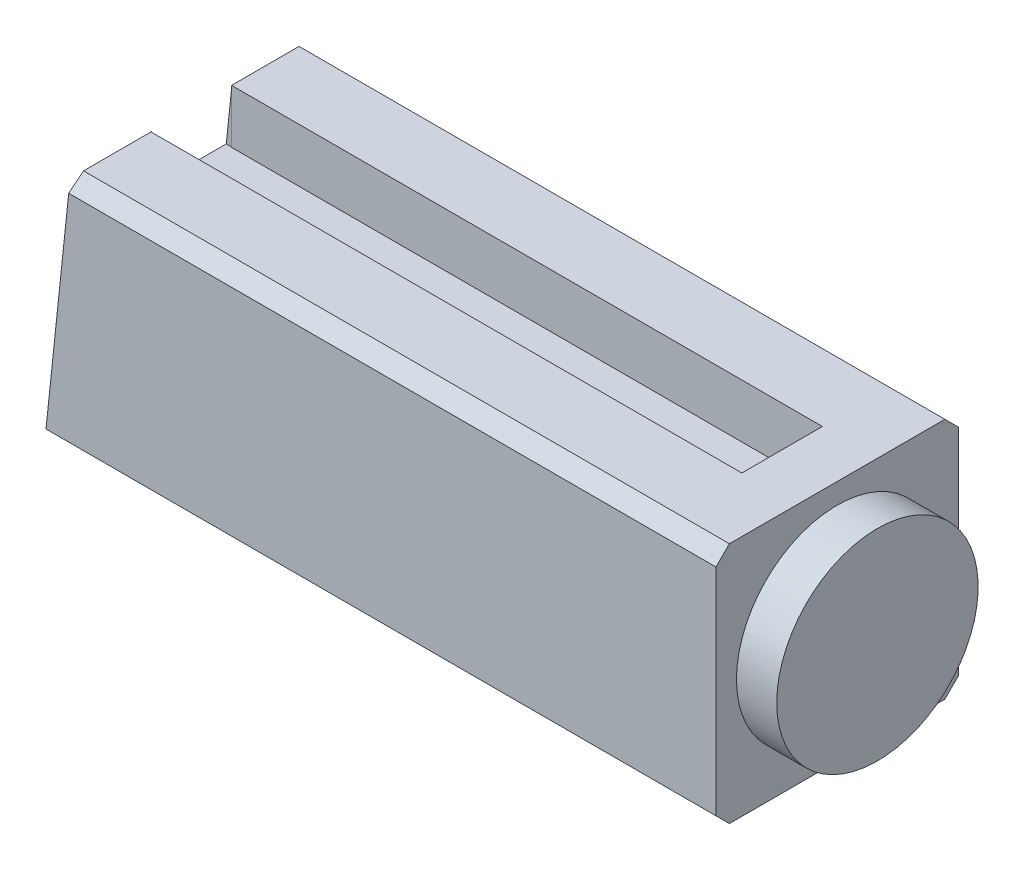
ISO-10303-21;
HEADER;
FILE_DESCRIPTION(('STEP AP214'),'2;1');
FILE_NAME('part.step','',(''),(''),'','','');
FILE_SCHEMA(('AUTOMOTIVE_DESIGN { 1 0 10303 214 1 1 1 1 }'));
ENDSEC;
DATA;
#1=APPLICATION_CONTEXT('core data for automotive mechanical design processes');
#2=APPLICATION_PROTOCOL_DEFINITION('international standard','automotive_design',2000,#1);
#3=PRODUCT_CONTEXT('',#1,'mechanical');
#4=PRODUCT('Part','Part','',(#3));
#5=PRODUCT_RELATED_PRODUCT_CATEGORY('part','',(#4));
#6=PRODUCT_DEFINITION_FORMATION('','',#4);
#7=PRODUCT_DEFINITION_CONTEXT('part definition',#1,'design');
#8=PRODUCT_DEFINITION('design','',#6,#7);
#9=PRODUCT_DEFINITION_SHAPE('','',#8);
#10=(LENGTH_UNIT() NAMED_UNIT(*) SI_UNIT(.MILLI.,.METRE.));
#11=(NAMED_UNIT(*) PLANE_ANGLE_UNIT() SI_UNIT($,.RADIAN.));
#12=(NAMED_UNIT(*) SI_UNIT($,.STERADIAN.) SOLID_ANGLE_UNIT());
#13=UNCERTAINTY_MEASURE_WITH_UNIT(LENGTH_MEASURE(1.E-05),#10,'distance_accuracy_value','');
#14=(GEOMETRIC_REPRESENTATION_CONTEXT(3) GLOBAL_UNCERTAINTY_ASSIGNED_CONTEXT((#13)) GLOBAL_UNIT_ASSIGNED_CONTEXT((#10,
#11,#12)) REPRESENTATION_CONTEXT('',''));
#15=CARTESIAN_POINT('',(0.,0.,0.));
#16=DIRECTION('',(0.,0.,1.));
#17=DIRECTION('',(1.,0.,0.));
#18=AXIS2_PLACEMENT_3D('',#15,#16,#17);
#19=CARTESIAN_POINT('',(-6.1087,1.27635,1.53035));
#20=DIRECTION('',(0.,0.,-1.));
#21=DIRECTION('',(-1.,0.,0.));
#22=AXIS2_PLACEMENT_3D('',#19,#20,#21);
#23=PLANE('',#22);
#24=DIRECTION('',(-0.707106781186547,-0.707106781186548,0.));
#25=VECTOR('',#24,1.);
#26=CARTESIAN_POINT('',(4.0513,1.27635,1.53035));
#27=LINE('',#26,#25);
#28=CARTESIAN_POINT('',(5.0673,2.29235,1.53035));
#29=VERTEX_POINT('',#28);
#30=CARTESIAN_POINT('',(4.0513,1.27635,1.53035));
#31=VERTEX_POINT('',#30);
#32=EDGE_CURVE('E164',#29,#31,#27,.T.);
#33=ORIENTED_EDGE('',*,*,#32,.F.);
#34=DIRECTION('',(-1.,0.,0.));
#35=VECTOR('',#34,1.);
#36=CARTESIAN_POINT('',(-6.1087,2.29235,1.53035));
#37=LINE('',#36,#35);
#38=CARTESIAN_POINT('',(-6.1087,2.29235,1.53035));
#39=VERTEX_POINT('',#38);
#40=EDGE_CURVE('E194',#29,#39,#37,.T.);
#41=ORIENTED_EDGE('',*,*,#40,.T.);
#42=DIRECTION('',(0.,1.,0.));
#43=VECTOR('',#42,1.);
#44=CARTESIAN_POINT('',(-6.1087,1.27635,1.53035));
#45=LINE('',#44,#43);
#46=CARTESIAN_POINT('',(-6.1087,1.27635,1.53035));
#47=VERTEX_POINT('',#46);
#48=EDGE_CURVE('E205',#47,#39,#45,.T.);
#49=ORIENTED_EDGE('',*,*,#48,.F.);
#50=DIRECTION('',(-1.,0.,0.));
#51=VECTOR('',#50,1.);
#52=CARTESIAN_POINT('',(-6.1087,1.27635,1.53035));
#53=LINE('',#52,#51);
#54=EDGE_CURVE('E151',#31,#47,#53,.T.);
#55=ORIENTED_EDGE('',*,*,#54,.F.);
#56=EDGE_LOOP('',(#33,#41,#49,#55));
#57=FACE_BOUND('',#56,.T.);
#58=ADVANCED_FACE('F35',(#57),#23,.F.);
#59=CARTESIAN_POINT('',(-6.1087,1.27635,3.05435));
#60=DIRECTION('',(0.,0.,1.));
#61=DIRECTION('',(1.,0.,0.));
#62=AXIS2_PLACEMENT_3D('',#59,#60,#61);
#63=PLANE('',#62);
#64=DIRECTION('',(-0.707106781186547,-0.707106781186548,0.));
#65=VECTOR('',#64,1.);
#66=CARTESIAN_POINT('',(4.0513,1.27635,3.05435));
#67=LINE('',#66,#65);
#68=CARTESIAN_POINT('',(5.0673,2.29235,3.05435));
#69=VERTEX_POINT('',#68);
#70=CARTESIAN_POINT('',(4.0513,1.27635,3.05435));
#71=VERTEX_POINT('',#70);
#72=EDGE_CURVE('E154',#69,#71,#67,.T.);
#73=ORIENTED_EDGE('',*,*,#72,.T.);
#74=DIRECTION('',(1.,0.,0.));
#75=VECTOR('',#74,1.);
#76=CARTESIAN_POINT('',(-6.1087,1.27635,3.05435));
#77=LINE('',#76,#75);
#78=CARTESIAN_POINT('',(-6.1087,1.27635,3.05435));
#79=VERTEX_POINT('',#78);
#80=EDGE_CURVE('E142',#79,#71,#77,.T.);
#81=ORIENTED_EDGE('',*,*,#80,.F.);
#82=DIRECTION('',(0.,1.,0.));
#83=VECTOR('',#82,1.);
#84=CARTESIAN_POINT('',(-6.1087,1.27635,3.05435));
#85=LINE('',#84,#83);
#86=CARTESIAN_POINT('',(-6.1087,2.29235,3.05435));
#87=VERTEX_POINT('',#86);
#88=EDGE_CURVE('E197',#79,#87,#85,.T.);
#89=ORIENTED_EDGE('',*,*,#88,.T.);
#90=DIRECTION('',(1.,0.,0.));
#91=VECTOR('',#90,1.);
#92=CARTESIAN_POINT('',(-6.1087,2.29235,3.05435));
#93=LINE('',#92,#91);
#94=EDGE_CURVE('E157',#87,#69,#93,.T.);
#95=ORIENTED_EDGE('',*,*,#94,.T.);
#96=EDGE_LOOP('',(#73,#81,#89,#95));
#97=FACE_BOUND('',#96,.T.);
#98=ADVANCED_FACE('F155',(#97),#63,.F.);
#99=CARTESIAN_POINT('',(0.,1.27635,0.));
#100=DIRECTION('',(0.,-1.,0.));
#101=DIRECTION('',(0.,0.,-1.));
#102=AXIS2_PLACEMENT_3D('',#99,#100,#101);
#103=PLANE('',#102);
#104=DIRECTION('',(0.,0.,-1.));
#105=VECTOR('',#104,1.);
#106=CARTESIAN_POINT('',(4.0513,1.27635,4.5867));
#107=LINE('',#106,#105);
#108=EDGE_CURVE('E51',#71,#31,#107,.T.);
#109=ORIENTED_EDGE('',*,*,#108,.T.);
#110=ORIENTED_EDGE('',*,*,#54,.T.);
#111=DIRECTION('',(0.,0.,-1.));
#112=VECTOR('',#111,1.);
#113=CARTESIAN_POINT('',(-6.1087,1.27635,3.048));
#114=LINE('',#113,#112);
#115=CARTESIAN_POINT('',(-6.1087,1.27635,1.524));
#116=VERTEX_POINT('',#115);
#117=EDGE_CURVE('E178',#47,#116,#114,.T.);
#118=ORIENTED_EDGE('',*,*,#117,.T.);
#119=DIRECTION('',(1.,0.,0.));
#120=VECTOR('',#119,1.);
#121=CARTESIAN_POINT('',(-6.5913,1.27635,1.524));
#122=LINE('',#121,#120);
#123=CARTESIAN_POINT('',(-6.21564736842105,1.27635,1.524));
#124=VERTEX_POINT('',#123);
#125=EDGE_CURVE('E184',#124,#116,#122,.T.);
#126=ORIENTED_EDGE('',*,*,#125,.F.);
#127=DIRECTION('',(0.,0.,-1.));
#128=VECTOR('',#127,1.);
#129=CARTESIAN_POINT('',(-6.21564736842105,1.27635,4.5847));
#130=LINE('',#129,#128);
#131=CARTESIAN_POINT('',(-6.21564736842105,1.27635,3.048));
#132=VERTEX_POINT('',#131);
#133=EDGE_CURVE('E186',#132,#124,#130,.T.);
#134=ORIENTED_EDGE('',*,*,#133,.F.);
#135=DIRECTION('',(1.,0.,0.));
#136=VECTOR('',#135,1.);
#137=CARTESIAN_POINT('',(-6.5913,1.27635,3.048));
#138=LINE('',#137,#136);
#139=CARTESIAN_POINT('',(-6.1087,1.27635,3.048));
#140=VERTEX_POINT('',#139);
#141=EDGE_CURVE('E183',#132,#140,#138,.T.);
#142=ORIENTED_EDGE('',*,*,#141,.T.);
#143=DIRECTION('',(0.,0.,1.));
#144=VECTOR('',#143,1.);
#145=CARTESIAN_POINT('',(-6.1087,1.27635,3.05435));
#146=LINE('',#145,#144);
#147=EDGE_CURVE('E147',#140,#79,#146,.T.);
#148=ORIENTED_EDGE('',*,*,#147,.T.);
#149=ORIENTED_EDGE('',*,*,#80,.T.);
#150=EDGE_LOOP('',(#109,#110,#118,#126,#134,#142,#148,#149));
#151=FACE_BOUND('',#150,.T.);
#152=ADVANCED_FACE('F144',(#151),#103,.F.);
#153=CARTESIAN_POINT('',(-6.28041095890411,0.661095890410957,4.5847));
#154=DIRECTION('',(0.994505452921406,-0.104684784518042,0.));
#155=DIRECTION('',(0.104684784518042,0.994505452921406,0.));
#156=AXIS2_PLACEMENT_3D('',#153,#154,#155);
#157=PLANE('',#156);
#158=DIRECTION('',(0.,0.,-1.));
#159=VECTOR('',#158,1.);
#160=CARTESIAN_POINT('',(-6.5913,-2.29235,4.5847));
#161=LINE('',#160,#159);
#162=CARTESIAN_POINT('',(-6.5913,-2.29235,4.3307));
#163=VERTEX_POINT('',#162);
#164=CARTESIAN_POINT('',(-6.5913,-2.29235,0.254000000000003));
#165=VERTEX_POINT('',#164);
#166=EDGE_CURVE('E230',#163,#165,#161,.T.);
#167=ORIENTED_EDGE('',*,*,#166,.F.);
#168=DIRECTION('',(0.0742269619025201,0.705156138073943,0.705156138073948));
#169=VECTOR('',#168,1.);
#170=CARTESIAN_POINT('',(-6.52839476584022,-1.6947502754821,4.92829972451791));
#171=LINE('',#170,#169);
#172=CARTESIAN_POINT('',(-6.56456315789474,-2.03835,4.5847));
#173=VERTEX_POINT('',#172);
#174=EDGE_CURVE('E257',#163,#173,#171,.T.);
#175=ORIENTED_EDGE('',*,*,#174,.T.);
#176=DIRECTION('',(-0.104684784518043,-0.994505452921406,0.));
#177=VECTOR('',#176,1.);
#178=CARTESIAN_POINT('',(-6.28041095890411,0.661095890410957,4.5847));
#179=LINE('',#178,#177);
#180=CARTESIAN_POINT('',(-6.13543684210526,2.03835,4.5847));
#181=VERTEX_POINT('',#180);
#182=EDGE_CURVE('E209',#181,#173,#179,.T.);
#183=ORIENTED_EDGE('',*,*,#182,.F.);
#184=DIRECTION('',(-0.0742269619025204,-0.705156138073945,0.705156138073945));
#185=VECTOR('',#184,1.);
#186=CARTESIAN_POINT('',(-6.07504325068871,2.6120891184573,4.0109608815427));
#187=LINE('',#186,#185);
#188=CARTESIAN_POINT('',(-6.1087,2.29235,4.3307));
#189=VERTEX_POINT('',#188);
#190=EDGE_CURVE('E59',#181,#189,#187,.F.);
#191=ORIENTED_EDGE('',*,*,#190,.T.);
#192=DIRECTION('',(0.,0.,-1.));
#193=VECTOR('',#192,1.);
#194=CARTESIAN_POINT('',(-6.1087,2.29235,4.5847));
#195=LINE('',#194,#193);
#196=EDGE_CURVE('E221',#189,#87,#195,.T.);
#197=ORIENTED_EDGE('',*,*,#196,.T.);
#198=DIRECTION('',(0.,0.,1.));
#199=VECTOR('',#198,1.);
#200=CARTESIAN_POINT('',(-6.1087,2.29235,3.05435));
#201=LINE('',#200,#199);
#202=CARTESIAN_POINT('',(-6.1087,2.29235,3.048));
#203=VERTEX_POINT('',#202);
#204=EDGE_CURVE('E193',#203,#87,#201,.T.);
#205=ORIENTED_EDGE('',*,*,#204,.F.);
#206=DIRECTION('',(-0.104684784518042,-0.994505452921406,0.));
#207=VECTOR('',#206,1.);
#208=CARTESIAN_POINT('',(-6.28041095890411,0.661095890410957,3.048));
#209=LINE('',#208,#207);
#210=EDGE_CURVE('E190',#203,#132,#209,.T.);
#211=ORIENTED_EDGE('',*,*,#210,.T.);
#212=ORIENTED_EDGE('',*,*,#133,.T.);
#213=DIRECTION('',(0.104684784518042,0.994505452921406,0.));
#214=VECTOR('',#213,1.);
#215=CARTESIAN_POINT('',(-6.28041095890411,0.661095890410958,1.524));
#216=LINE('',#215,#214);
#217=CARTESIAN_POINT('',(-6.1087,2.29235,1.524));
#218=VERTEX_POINT('',#217);
#219=EDGE_CURVE('E176',#124,#218,#216,.T.);
#220=ORIENTED_EDGE('',*,*,#219,.T.);
#221=CARTESIAN_POINT('',(-6.1087,2.29235,0.254000000000003));
#222=VERTEX_POINT('',#221);
#223=EDGE_CURVE('E216',#218,#222,#195,.T.);
#224=ORIENTED_EDGE('',*,*,#223,.T.);
#225=DIRECTION('',(-0.0742269619025204,-0.705156138073945,-0.705156138073945));
#226=VECTOR('',#225,1.);
#227=CARTESIAN_POINT('',(-6.10163278236915,2.35948856749311,0.321138567493112));
#228=LINE('',#227,#226);
#229=CARTESIAN_POINT('',(-6.13543684210526,2.03835,0.));
#230=VERTEX_POINT('',#229);
#231=EDGE_CURVE('E252',#222,#230,#228,.T.);
#232=ORIENTED_EDGE('',*,*,#231,.T.);
#233=DIRECTION('',(-0.104684784518043,-0.994505452921406,0.));
#234=VECTOR('',#233,1.);
#235=CARTESIAN_POINT('',(-6.28041095890411,0.661095890410957,0.));
#236=LINE('',#235,#234);
#237=CARTESIAN_POINT('',(-6.56456315789474,-2.03835,0.));
#238=VERTEX_POINT('',#237);
#239=EDGE_CURVE('E207',#230,#238,#236,.T.);
#240=ORIENTED_EDGE('',*,*,#239,.T.);
#241=DIRECTION('',(0.0742269619025204,0.705156138073945,-0.705156138073945));
#242=VECTOR('',#241,1.);
#243=CARTESIAN_POINT('',(-6.55498429752066,-1.94735082644628,-0.0909991735537157));
#244=LINE('',#243,#242);
#245=EDGE_CURVE('E255',#238,#165,#244,.F.);
#246=ORIENTED_EDGE('',*,*,#245,.T.);
#247=EDGE_LOOP('',(#167,#175,#183,#191,#197,#205,#211,#212,#220,#224,#232,#240,#246));
#248=FACE_BOUND('',#247,.T.);
#249=ADVANCED_FACE('F273',(#248),#157,.F.);
#250=CARTESIAN_POINT('',(0.,-2.29235,4.5847));
#251=DIRECTION('',(0.,1.,0.));
#252=DIRECTION('',(0.,0.,1.));
#253=AXIS2_PLACEMENT_3D('',#250,#251,#252);
#254=PLANE('',#253);
#255=DIRECTION('',(0.,0.,-1.));
#256=VECTOR('',#255,1.);
#257=CARTESIAN_POINT('',(6.1087,-2.29235,4.5847));
#258=LINE('',#257,#256);
#259=CARTESIAN_POINT('',(6.1087,-2.29235,4.3307));
#260=VERTEX_POINT('',#259);
#261=CARTESIAN_POINT('',(6.1087,-2.29235,0.254000000000003));
#262=VERTEX_POINT('',#261);
#263=EDGE_CURVE('E227',#260,#262,#258,.T.);
#264=ORIENTED_EDGE('',*,*,#263,.F.);
#265=DIRECTION('',(-1.,0.,0.));
#266=VECTOR('',#265,1.);
#267=CARTESIAN_POINT('',(-6.5913,-2.29235,4.3307));
#268=LINE('',#267,#266);
#269=EDGE_CURVE('E250',#260,#163,#268,.T.);
#270=ORIENTED_EDGE('',*,*,#269,.T.);
#271=ORIENTED_EDGE('',*,*,#166,.T.);
#272=DIRECTION('',(1.,0.,0.));
#273=VECTOR('',#272,1.);
#274=CARTESIAN_POINT('',(0.,-2.29235,0.254000000000003));
#275=LINE('',#274,#273);
#276=EDGE_CURVE('E247',#165,#262,#275,.T.);
#277=ORIENTED_EDGE('',*,*,#276,.T.);
#278=EDGE_LOOP('',(#264,#270,#271,#277));
#279=FACE_BOUND('',#278,.T.);
#280=ADVANCED_FACE('F289',(#279),#254,.F.);
#281=CARTESIAN_POINT('',(6.1087,0.,4.5847));
#282=DIRECTION('',(-1.,0.,0.));
#283=DIRECTION('',(0.,0.,1.));
#284=AXIS2_PLACEMENT_3D('',#281,#282,#283);
#285=PLANE('',#284);
#286=CARTESIAN_POINT('',(6.1087,0.,2.29235));
#287=DIRECTION('',(1.,0.,0.));
#288=DIRECTION('',(0.,0.,-1.));
#289=AXIS2_PLACEMENT_3D('',#286,#287,#288);
#290=CIRCLE('',#289,1.905);
#291=CARTESIAN_POINT('',(6.1087,0.,4.19735));
#292=VERTEX_POINT('',#291);
#293=EDGE_CURVE('E172',#292,#292,#290,.T.);
#294=ORIENTED_EDGE('',*,*,#293,.F.);
#295=EDGE_LOOP('',(#294));
#296=FACE_BOUND('',#295,.T.);
#297=DIRECTION('',(0.,1.,0.));
#298=VECTOR('',#297,1.);
#299=CARTESIAN_POINT('',(6.1087,0.,4.5847));
#300=LINE('',#299,#298);
#301=CARTESIAN_POINT('',(6.1087,-2.03835,4.5847));
#302=VERTEX_POINT('',#301);
#303=CARTESIAN_POINT('',(6.1087,2.03835,4.5847));
#304=VERTEX_POINT('',#303);
#305=EDGE_CURVE('E212',#302,#304,#300,.T.);
#306=ORIENTED_EDGE('',*,*,#305,.F.);
#307=DIRECTION('',(0.,-0.707106781186545,-0.70710678118655));
#308=VECTOR('',#307,1.);
#309=CARTESIAN_POINT('',(6.1087,-2.03835,4.5847));
#310=LINE('',#309,#308);
#311=EDGE_CURVE('E245',#302,#260,#310,.T.);
#312=ORIENTED_EDGE('',*,*,#311,.T.);
#313=ORIENTED_EDGE('',*,*,#263,.T.);
#314=DIRECTION('',(0.,-0.707106781186548,0.707106781186548));
#315=VECTOR('',#314,1.);
#316=CARTESIAN_POINT('',(6.1087,-2.29235,0.254000000000003));
#317=LINE('',#316,#315);
#318=CARTESIAN_POINT('',(6.1087,-2.03835,0.));
#319=VERTEX_POINT('',#318);
#320=EDGE_CURVE('E243',#262,#319,#317,.F.);
#321=ORIENTED_EDGE('',*,*,#320,.T.);
#322=DIRECTION('',(0.,1.,0.));
#323=VECTOR('',#322,1.);
#324=CARTESIAN_POINT('',(6.1087,0.,0.));
#325=LINE('',#324,#323);
#326=CARTESIAN_POINT('',(6.1087,2.03835,0.));
#327=VERTEX_POINT('',#326);
#328=EDGE_CURVE('E213',#319,#327,#325,.T.);
#329=ORIENTED_EDGE('',*,*,#328,.T.);
#330=DIRECTION('',(0.,0.707106781186548,0.707106781186548));
#331=VECTOR('',#330,1.);
#332=CARTESIAN_POINT('',(6.1087,2.03835,0.));
#333=LINE('',#332,#331);
#334=CARTESIAN_POINT('',(6.1087,2.29235,0.254000000000003));
#335=VERTEX_POINT('',#334);
#336=EDGE_CURVE('E239',#327,#335,#333,.T.);
#337=ORIENTED_EDGE('',*,*,#336,.T.);
#338=DIRECTION('',(0.,0.,-1.));
#339=VECTOR('',#338,1.);
#340=CARTESIAN_POINT('',(6.1087,2.29235,4.5847));
#341=LINE('',#340,#339);
#342=CARTESIAN_POINT('',(6.1087,2.29235,4.3307));
#343=VERTEX_POINT('',#342);
#344=EDGE_CURVE('E223',#343,#335,#341,.T.);
#345=ORIENTED_EDGE('',*,*,#344,.F.);
#346=DIRECTION('',(0.,0.707106781186548,-0.707106781186548));
#347=VECTOR('',#346,1.);
#348=CARTESIAN_POINT('',(6.1087,2.29235,4.3307));
#349=LINE('',#348,#347);
#350=EDGE_CURVE('E241',#343,#304,#349,.F.);
#351=ORIENTED_EDGE('',*,*,#350,.T.);
#352=EDGE_LOOP('',(#306,#312,#313,#321,#329,#337,#345,#351));
#353=FACE_BOUND('',#352,.T.);
#354=ADVANCED_FACE('F282',(#296,#353),#285,.F.);
#355=CARTESIAN_POINT('',(0.,2.29235,4.5847));
#356=DIRECTION('',(0.,1.,0.));
#357=DIRECTION('',(0.,0.,1.));
#358=AXIS2_PLACEMENT_3D('',#355,#356,#357);
#359=PLANE('',#358);
#360=ORIENTED_EDGE('',*,*,#196,.F.);
#361=DIRECTION('',(1.,0.,0.));
#362=VECTOR('',#361,1.);
#363=CARTESIAN_POINT('',(0.,2.29235,4.3307));
#364=LINE('',#363,#362);
#365=EDGE_CURVE('E11',#189,#343,#364,.T.);
#366=ORIENTED_EDGE('',*,*,#365,.T.);
#367=ORIENTED_EDGE('',*,*,#344,.T.);
#368=DIRECTION('',(-1.,0.,0.));
#369=VECTOR('',#368,1.);
#370=CARTESIAN_POINT('',(-6.1087,2.29235,0.254000000000003));
#371=LINE('',#370,#369);
#372=EDGE_CURVE('E44',#335,#222,#371,.T.);
#373=ORIENTED_EDGE('',*,*,#372,.T.);
#374=ORIENTED_EDGE('',*,*,#223,.F.);
#375=EDGE_CURVE('E224',#39,#218,#195,.T.);
#376=ORIENTED_EDGE('',*,*,#375,.F.);
#377=ORIENTED_EDGE('',*,*,#40,.F.);
#378=DIRECTION('',(0.,0.,-1.));
#379=VECTOR('',#378,1.);
#380=CARTESIAN_POINT('',(5.0673,2.29235,3.05435));
#381=LINE('',#380,#379);
#382=EDGE_CURVE('E201',#69,#29,#381,.T.);
#383=ORIENTED_EDGE('',*,*,#382,.F.);
#384=ORIENTED_EDGE('',*,*,#94,.F.);
#385=EDGE_LOOP('',(#360,#366,#367,#373,#374,#376,#377,#383,#384));
#386=FACE_BOUND('',#385,.T.);
#387=ADVANCED_FACE('F267',(#386),#359,.T.);
#388=CARTESIAN_POINT('',(0.,0.,4.5847));
#389=DIRECTION('',(0.,0.,1.));
#390=DIRECTION('',(1.,0.,0.));
#391=AXIS2_PLACEMENT_3D('',#388,#389,#390);
#392=PLANE('',#391);
#393=ORIENTED_EDGE('',*,*,#182,.T.);
#394=DIRECTION('',(1.,0.,0.));
#395=VECTOR('',#394,1.);
#396=CARTESIAN_POINT('',(6.1087,-2.03835,4.5847));
#397=LINE('',#396,#395);
#398=EDGE_CURVE('E236',#173,#302,#397,.T.);
#399=ORIENTED_EDGE('',*,*,#398,.T.);
#400=ORIENTED_EDGE('',*,*,#305,.T.);
#401=DIRECTION('',(-1.,0.,0.));
#402=VECTOR('',#401,1.);
#403=CARTESIAN_POINT('',(0.,2.03835,4.5847));
#404=LINE('',#403,#402);
#405=EDGE_CURVE('E175',#304,#181,#404,.T.);
#406=ORIENTED_EDGE('',*,*,#405,.T.);
#407=EDGE_LOOP('',(#393,#399,#400,#406));
#408=FACE_BOUND('',#407,.T.);
#409=ADVANCED_FACE('F296',(#408),#392,.T.);
#410=CARTESIAN_POINT('',(0.,0.,0.));
#411=DIRECTION('',(0.,0.,1.));
#412=DIRECTION('',(1.,0.,0.));
#413=AXIS2_PLACEMENT_3D('',#410,#411,#412);
#414=PLANE('',#413);
#415=ORIENTED_EDGE('',*,*,#328,.F.);
#416=DIRECTION('',(-1.,0.,0.));
#417=VECTOR('',#416,1.);
#418=CARTESIAN_POINT('',(0.,-2.03835,0.));
#419=LINE('',#418,#417);
#420=EDGE_CURVE('E262',#319,#238,#419,.T.);
#421=ORIENTED_EDGE('',*,*,#420,.T.);
#422=ORIENTED_EDGE('',*,*,#239,.F.);
#423=DIRECTION('',(1.,0.,0.));
#424=VECTOR('',#423,1.);
#425=CARTESIAN_POINT('',(6.1087,2.03835,0.));
#426=LINE('',#425,#424);
#427=EDGE_CURVE('E259',#230,#327,#426,.T.);
#428=ORIENTED_EDGE('',*,*,#427,.T.);
#429=EDGE_LOOP('',(#415,#421,#422,#428));
#430=FACE_BOUND('',#429,.T.);
#431=ADVANCED_FACE('F278',(#430),#414,.F.);
#432=CARTESIAN_POINT('',(-6.1087,1.27635,3.05435));
#433=DIRECTION('',(-1.,0.,0.));
#434=DIRECTION('',(0.,0.,1.));
#435=AXIS2_PLACEMENT_3D('',#432,#433,#434);
#436=PLANE('',#435);
#437=ORIENTED_EDGE('',*,*,#147,.F.);
#438=DIRECTION('',(0.,-1.,0.));
#439=VECTOR('',#438,1.);
#440=CARTESIAN_POINT('',(-6.1087,2.29235,3.048));
#441=LINE('',#440,#439);
#442=EDGE_CURVE('E171',#203,#140,#441,.T.);
#443=ORIENTED_EDGE('',*,*,#442,.F.);
#444=ORIENTED_EDGE('',*,*,#204,.T.);
#445=ORIENTED_EDGE('',*,*,#88,.F.);
#446=EDGE_LOOP('',(#437,#443,#444,#445));
#447=FACE_BOUND('',#446,.T.);
#448=ADVANCED_FACE('F304',(#447),#436,.F.);
#449=CARTESIAN_POINT('',(-6.5913,2.29235,1.524));
#450=DIRECTION('',(0.,0.,-1.));
#451=DIRECTION('',(0.,1.,0.));
#452=AXIS2_PLACEMENT_3D('',#449,#450,#451);
#453=PLANE('',#452);
#454=ORIENTED_EDGE('',*,*,#125,.T.);
#455=DIRECTION('',(0.,1.,0.));
#456=VECTOR('',#455,1.);
#457=CARTESIAN_POINT('',(-6.1087,2.29235,1.524));
#458=LINE('',#457,#456);
#459=EDGE_CURVE('E181',#116,#218,#458,.T.);
#460=ORIENTED_EDGE('',*,*,#459,.T.);
#461=ORIENTED_EDGE('',*,*,#219,.F.);
#462=EDGE_LOOP('',(#454,#460,#461));
#463=FACE_BOUND('',#462,.T.);
#464=ADVANCED_FACE('F312',(#463),#453,.F.);
#465=CARTESIAN_POINT('',(-6.5913,2.29235,3.048));
#466=DIRECTION('',(0.,0.,1.));
#467=DIRECTION('',(1.,0.,0.));
#468=AXIS2_PLACEMENT_3D('',#465,#466,#467);
#469=PLANE('',#468);
#470=ORIENTED_EDGE('',*,*,#442,.T.);
#471=ORIENTED_EDGE('',*,*,#141,.F.);
#472=ORIENTED_EDGE('',*,*,#210,.F.);
#473=EDGE_LOOP('',(#470,#471,#472));
#474=FACE_BOUND('',#473,.T.);
#475=ADVANCED_FACE('F307',(#474),#469,.F.);
#476=CARTESIAN_POINT('',(-6.1087,0.,0.));
#477=DIRECTION('',(1.,0.,0.));
#478=DIRECTION('',(0.,0.,-1.));
#479=AXIS2_PLACEMENT_3D('',#476,#477,#478);
#480=PLANE('',#479);
#481=ORIENTED_EDGE('',*,*,#375,.T.);
#482=ORIENTED_EDGE('',*,*,#459,.F.);
#483=ORIENTED_EDGE('',*,*,#117,.F.);
#484=ORIENTED_EDGE('',*,*,#48,.T.);
#485=EDGE_LOOP('',(#481,#482,#483,#484));
#486=FACE_BOUND('',#485,.T.);
#487=ADVANCED_FACE('F315',(#486),#480,.F.);
#488=CARTESIAN_POINT('',(6.8707,0.,2.29235));
#489=DIRECTION('',(-1.,0.,0.));
#490=DIRECTION('',(0.,0.,1.));
#491=AXIS2_PLACEMENT_3D('',#488,#489,#490);
#492=CYLINDRICAL_SURFACE('',#491,1.905);
#493=CARTESIAN_POINT('',(6.8707,0.,2.29235));
#494=DIRECTION('',(1.,0.,0.));
#495=DIRECTION('',(0.,0.,-1.));
#496=AXIS2_PLACEMENT_3D('',#493,#494,#495);
#497=CIRCLE('',#496,1.905);
#498=CARTESIAN_POINT('',(6.8707,0.,4.19735));
#499=VERTEX_POINT('',#498);
#500=EDGE_CURVE('E166',#499,#499,#497,.T.);
#501=CARTESIAN_POINT('',(6.8707,0.,4.19735));
#502=CARTESIAN_POINT('',(6.8627625,0.,4.19735));
#503=CARTESIAN_POINT('',(6.854825,0.,4.19735));
#504=CARTESIAN_POINT('',(6.83895,0.,4.19735));
#505=CARTESIAN_POINT('',(6.8310125,0.,4.19735));
#506=CARTESIAN_POINT('',(6.8151375,0.,4.19735));
#507=CARTESIAN_POINT('',(6.8072,0.,4.19735));
#508=CARTESIAN_POINT('',(6.791325,0.,4.19735));
#509=CARTESIAN_POINT('',(6.7833875,0.,4.19735));
#510=CARTESIAN_POINT('',(6.7675125,0.,4.19735));
#511=CARTESIAN_POINT('',(6.759575,0.,4.19735));
#512=CARTESIAN_POINT('',(6.7437,0.,4.19735));
#513=CARTESIAN_POINT('',(6.7357625,0.,4.19735));
#514=CARTESIAN_POINT('',(6.7198875,0.,4.19735));
#515=CARTESIAN_POINT('',(6.71195,0.,4.19735));
#516=CARTESIAN_POINT('',(6.696075,0.,4.19735));
#517=CARTESIAN_POINT('',(6.6881375,0.,4.19735));
#518=CARTESIAN_POINT('',(6.6722625,0.,4.19735));
#519=CARTESIAN_POINT('',(6.664325,0.,4.19735));
#520=CARTESIAN_POINT('',(6.64845,0.,4.19735));
#521=CARTESIAN_POINT('',(6.6405125,0.,4.19735));
#522=CARTESIAN_POINT('',(6.6246375,0.,4.19735));
#523=CARTESIAN_POINT('',(6.6167,0.,4.19735));
#524=CARTESIAN_POINT('',(6.600825,0.,4.19735));
#525=CARTESIAN_POINT('',(6.5928875,0.,4.19735));
#526=CARTESIAN_POINT('',(6.5770125,0.,4.19735));
#527=CARTESIAN_POINT('',(6.569075,0.,4.19735));
#528=CARTESIAN_POINT('',(6.5532,0.,4.19735));
#529=CARTESIAN_POINT('',(6.5452625,0.,4.19735));
#530=CARTESIAN_POINT('',(6.5293875,0.,4.19735));
#531=CARTESIAN_POINT('',(6.52145,0.,4.19735));
#532=CARTESIAN_POINT('',(6.505575,0.,4.19735));
#533=CARTESIAN_POINT('',(6.4976375,0.,4.19735));
#534=CARTESIAN_POINT('',(6.4817625,0.,4.19735));
#535=CARTESIAN_POINT('',(6.473825,0.,4.19735));
#536=CARTESIAN_POINT('',(6.45795,0.,4.19735));
#537=CARTESIAN_POINT('',(6.4500125,0.,4.19735));
#538=CARTESIAN_POINT('',(6.4341375,0.,4.19735));
#539=CARTESIAN_POINT('',(6.4262,0.,4.19735));
#540=CARTESIAN_POINT('',(6.410325,0.,4.19735));
#541=CARTESIAN_POINT('',(6.4023875,0.,4.19735));
#542=CARTESIAN_POINT('',(6.3865125,0.,4.19735));
#543=CARTESIAN_POINT('',(6.378575,0.,4.19735));
#544=CARTESIAN_POINT('',(6.3627,0.,4.19735));
#545=CARTESIAN_POINT('',(6.3547625,0.,4.19735));
#546=CARTESIAN_POINT('',(6.3388875,0.,4.19735));
#547=CARTESIAN_POINT('',(6.33095,0.,4.19735));
#548=CARTESIAN_POINT('',(6.315075,0.,4.19735));
#549=CARTESIAN_POINT('',(6.3071375,0.,4.19735));
#550=CARTESIAN_POINT('',(6.2912625,0.,4.19735));
#551=CARTESIAN_POINT('',(6.283325,0.,4.19735));
#552=CARTESIAN_POINT('',(6.26745,0.,4.19735));
#553=CARTESIAN_POINT('',(6.2595125,0.,4.19735));
#554=CARTESIAN_POINT('',(6.2436375,0.,4.19735));
#555=CARTESIAN_POINT('',(6.2357,0.,4.19735));
#556=CARTESIAN_POINT('',(6.219825,0.,4.19735));
#557=CARTESIAN_POINT('',(6.2118875,0.,4.19735));
#558=CARTESIAN_POINT('',(6.1960125,0.,4.19735));
#559=CARTESIAN_POINT('',(6.188075,0.,4.19735));
#560=CARTESIAN_POINT('',(6.1722,0.,4.19735));
#561=CARTESIAN_POINT('',(6.1642625,0.,4.19735));
#562=CARTESIAN_POINT('',(6.1483875,0.,4.19735));
#563=CARTESIAN_POINT('',(6.14045,0.,4.19735));
#564=CARTESIAN_POINT('',(6.124575,0.,4.19735));
#565=CARTESIAN_POINT('',(6.1166375,0.,4.19735));
#566=CARTESIAN_POINT('',(6.1087,0.,4.19735));
#567=B_SPLINE_CURVE_WITH_KNOTS('',3,(#501,#502,#503,#504,#505,#506,#507,#508,#509,#510,#511,
#512,#513,#514,#515,#516,#517,#518,#519,#520,#521,#522,#523,#524,#525,#526,#527,#528,#529,#530,
#531,#532,#533,#534,#535,#536,#537,#538,#539,#540,#541,#542,#543,#544,#545,#546,#547,#548,#549,
#550,#551,#552,#553,#554,#555,#556,#557,#558,#559,#560,#561,#562,#563,#564,#565,#566),
.UNSPECIFIED.,.F.,.F.,(4,2,2,2,2,2,2,2,2,2,2,2,2,2,2,2,2,2,2,2,2,2,2,2,2,2,2,2,2,2,2,2,4),(0.,
0.0238125000000004,0.0476250000000008,0.0714375000000003,0.0952500000000007,0.1190625,
0.142875000000001,0.1666875,0.190500000000001,0.2143125,0.238125,0.2619375,0.28575,0.3095625,
0.333375,0.357187500000001,0.381,0.404812500000001,0.428625,0.452437500000001,0.47625,
0.500062500000001,0.523875,0.5476875,0.5715,0.5953125,0.619125,0.6429375,0.66675,0.6905625,
0.714375000000001,0.7381875,0.762000000000001),.UNSPECIFIED.);
#568=EDGE_CURVE('BSEAM369',#499,#292,#567,.T.);
#569=ORIENTED_EDGE('',*,*,#500,.F.);
#570=ORIENTED_EDGE('',*,*,#293,.T.);
#571=ORIENTED_EDGE('',*,*,#568,.T.);
#572=ORIENTED_EDGE('',*,*,#568,.F.);
#573=EDGE_LOOP('',(#569,#571,#570,#572));
#574=FACE_BOUND('',#573,.T.);
#575=ADVANCED_FACE('F369',(#574),#492,.T.);
#576=CARTESIAN_POINT('',(6.8707,0.,2.29235));
#577=DIRECTION('',(1.,0.,0.));
#578=DIRECTION('',(0.,0.,-1.));
#579=AXIS2_PLACEMENT_3D('',#576,#577,#578);
#580=PLANE('',#579);
#581=ORIENTED_EDGE('',*,*,#500,.T.);
#582=EDGE_LOOP('',(#581));
#583=FACE_BOUND('',#582,.T.);
#584=ADVANCED_FACE('F349',(#583),#580,.T.);
#585=CARTESIAN_POINT('',(0.,-2.03835,4.5847));
#586=DIRECTION('',(0.,-0.70710678118655,0.707106781186545));
#587=DIRECTION('',(-1.,0.,0.));
#588=AXIS2_PLACEMENT_3D('',#585,#586,#587);
#589=PLANE('',#588);
#590=ORIENTED_EDGE('',*,*,#174,.F.);
#591=ORIENTED_EDGE('',*,*,#269,.F.);
#592=ORIENTED_EDGE('',*,*,#311,.F.);
#593=ORIENTED_EDGE('',*,*,#398,.F.);
#594=EDGE_LOOP('',(#590,#591,#592,#593));
#595=FACE_BOUND('',#594,.T.);
#596=ADVANCED_FACE('F294',(#595),#589,.T.);
#597=CARTESIAN_POINT('',(0.,-2.29235,0.254000000000003));
#598=DIRECTION('',(0.,0.707106781186548,0.707106781186548));
#599=DIRECTION('',(1.,0.,0.));
#600=AXIS2_PLACEMENT_3D('',#597,#598,#599);
#601=PLANE('',#600);
#602=ORIENTED_EDGE('',*,*,#245,.F.);
#603=ORIENTED_EDGE('',*,*,#420,.F.);
#604=ORIENTED_EDGE('',*,*,#320,.F.);
#605=ORIENTED_EDGE('',*,*,#276,.F.);
#606=EDGE_LOOP('',(#602,#603,#604,#605));
#607=FACE_BOUND('',#606,.T.);
#608=ADVANCED_FACE('F287',(#607),#601,.F.);
#609=CARTESIAN_POINT('',(0.,2.29235,4.3307));
#610=DIRECTION('',(0.,-0.707106781186547,-0.707106781186547));
#611=DIRECTION('',(1.,0.,0.));
#612=AXIS2_PLACEMENT_3D('',#609,#610,#611);
#613=PLANE('',#612);
#614=ORIENTED_EDGE('',*,*,#190,.F.);
#615=ORIENTED_EDGE('',*,*,#405,.F.);
#616=ORIENTED_EDGE('',*,*,#350,.F.);
#617=ORIENTED_EDGE('',*,*,#365,.F.);
#618=EDGE_LOOP('',(#614,#615,#616,#617));
#619=FACE_BOUND('',#618,.T.);
#620=ADVANCED_FACE('F300',(#619),#613,.F.);
#621=CARTESIAN_POINT('',(0.,2.03835,0.));
#622=DIRECTION('',(0.,0.707106781186548,-0.707106781186548));
#623=DIRECTION('',(-1.,0.,0.));
#624=AXIS2_PLACEMENT_3D('',#621,#622,#623);
#625=PLANE('',#624);
#626=ORIENTED_EDGE('',*,*,#231,.F.);
#627=ORIENTED_EDGE('',*,*,#372,.F.);
#628=ORIENTED_EDGE('',*,*,#336,.F.);
#629=ORIENTED_EDGE('',*,*,#427,.F.);
#630=EDGE_LOOP('',(#626,#627,#628,#629));
#631=FACE_BOUND('',#630,.T.);
#632=ADVANCED_FACE('F38',(#631),#625,.T.);
#633=CARTESIAN_POINT('',(4.0513,1.27635,4.5867));
#634=DIRECTION('',(0.707106781186548,-0.707106781186547,0.));
#635=DIRECTION('',(0.707106781186547,0.707106781186548,0.));
#636=AXIS2_PLACEMENT_3D('',#633,#634,#635);
#637=PLANE('',#636);
#638=ORIENTED_EDGE('',*,*,#72,.F.);
#639=ORIENTED_EDGE('',*,*,#382,.T.);
#640=ORIENTED_EDGE('',*,*,#32,.T.);
#641=ORIENTED_EDGE('',*,*,#108,.F.);
#642=EDGE_LOOP('',(#638,#639,#640,#641));
#643=FACE_BOUND('',#642,.T.);
#644=ADVANCED_FACE('F163',(#643),#637,.F.);
#645=CLOSED_SHELL('',(#58,#98,#152,#249,#280,#354,#387,#409,#431,#448,#464,#475,#487,#575,#584,
#596,#608,#620,#632,#644));
#646=MANIFOLD_SOLID_BREP('B2',#645);
#647=ADVANCED_BREP_SHAPE_REPRESENTATION('',(#18,#646),#14);
#648=SHAPE_DEFINITION_REPRESENTATION(#9,#647);
ENDSEC;
END-ISO-10303-21;
